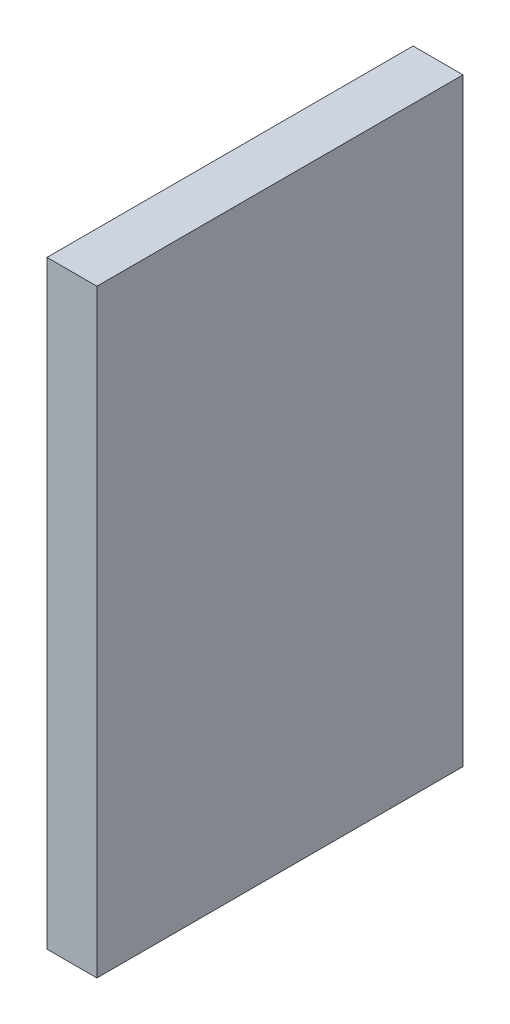
ISO-10303-21;
HEADER;
FILE_DESCRIPTION(('STEP AP214'),'2;1');
FILE_NAME('part.step','',(''),(''),'','','');
FILE_SCHEMA(('AUTOMOTIVE_DESIGN { 1 0 10303 214 1 1 1 1 }'));
ENDSEC;
DATA;
#1=APPLICATION_CONTEXT('core data for automotive mechanical design processes');
#2=APPLICATION_PROTOCOL_DEFINITION('international standard','automotive_design',2000,#1);
#3=PRODUCT_CONTEXT('',#1,'mechanical');
#4=PRODUCT('Part','Part','',(#3));
#5=PRODUCT_RELATED_PRODUCT_CATEGORY('part','',(#4));
#6=PRODUCT_DEFINITION_FORMATION('','',#4);
#7=PRODUCT_DEFINITION_CONTEXT('part definition',#1,'design');
#8=PRODUCT_DEFINITION('design','',#6,#7);
#9=PRODUCT_DEFINITION_SHAPE('','',#8);
#10=(LENGTH_UNIT() NAMED_UNIT(*) SI_UNIT(.MILLI.,.METRE.));
#11=(NAMED_UNIT(*) PLANE_ANGLE_UNIT() SI_UNIT($,.RADIAN.));
#12=(NAMED_UNIT(*) SI_UNIT($,.STERADIAN.) SOLID_ANGLE_UNIT());
#13=UNCERTAINTY_MEASURE_WITH_UNIT(LENGTH_MEASURE(1.E-05),#10,'distance_accuracy_value','');
#14=(GEOMETRIC_REPRESENTATION_CONTEXT(3) GLOBAL_UNCERTAINTY_ASSIGNED_CONTEXT((#13)) GLOBAL_UNIT_ASSIGNED_CONTEXT((#10,
#11,#12)) REPRESENTATION_CONTEXT('',''));
#15=CARTESIAN_POINT('',(0.,0.,0.));
#16=DIRECTION('',(0.,0.,1.));
#17=DIRECTION('',(1.,0.,0.));
#18=AXIS2_PLACEMENT_3D('',#15,#16,#17);
#19=CARTESIAN_POINT('',(37.5,-900.,0.));
#20=DIRECTION('',(1.,0.,0.));
#21=DIRECTION('',(0.,0.,-1.));
#22=AXIS2_PLACEMENT_3D('',#19,#20,#21);
#23=PLANE('',#22);
#24=DIRECTION('',(0.,0.,-1.));
#25=VECTOR('',#24,1.);
#26=CARTESIAN_POINT('',(37.5,0.,0.));
#27=LINE('',#26,#25);
#28=CARTESIAN_POINT('',(37.5,0.,550.));
#29=VERTEX_POINT('',#28);
#30=CARTESIAN_POINT('',(37.5,0.,0.));
#31=VERTEX_POINT('',#30);
#32=EDGE_CURVE('E106',#29,#31,#27,.T.);
#33=ORIENTED_EDGE('',*,*,#32,.F.);
#34=DIRECTION('',(0.,1.,0.));
#35=VECTOR('',#34,1.);
#36=CARTESIAN_POINT('',(37.5,-900.,550.));
#37=LINE('',#36,#35);
#38=CARTESIAN_POINT('',(37.5,-900.,550.));
#39=VERTEX_POINT('',#38);
#40=EDGE_CURVE('E11',#39,#29,#37,.T.);
#41=ORIENTED_EDGE('',*,*,#40,.F.);
#42=DIRECTION('',(0.,0.,-1.));
#43=VECTOR('',#42,1.);
#44=CARTESIAN_POINT('',(37.5,-900.,0.));
#45=LINE('',#44,#43);
#46=CARTESIAN_POINT('',(37.5,-900.,0.));
#47=VERTEX_POINT('',#46);
#48=EDGE_CURVE('E99',#39,#47,#45,.T.);
#49=ORIENTED_EDGE('',*,*,#48,.T.);
#50=DIRECTION('',(0.,1.,0.));
#51=VECTOR('',#50,1.);
#52=CARTESIAN_POINT('',(37.5,-900.,0.));
#53=LINE('',#52,#51);
#54=EDGE_CURVE('E43',#47,#31,#53,.T.);
#55=ORIENTED_EDGE('',*,*,#54,.T.);
#56=EDGE_LOOP('',(#33,#41,#49,#55));
#57=FACE_BOUND('',#56,.T.);
#58=ADVANCED_FACE('F40',(#57),#23,.T.);
#59=CARTESIAN_POINT('',(37.5,-900.,550.));
#60=DIRECTION('',(0.,0.,1.));
#61=DIRECTION('',(1.,0.,0.));
#62=AXIS2_PLACEMENT_3D('',#59,#60,#61);
#63=PLANE('',#62);
#64=DIRECTION('',(1.,0.,0.));
#65=VECTOR('',#64,1.);
#66=CARTESIAN_POINT('',(37.5,0.,550.));
#67=LINE('',#66,#65);
#68=CARTESIAN_POINT('',(-37.5,0.,550.));
#69=VERTEX_POINT('',#68);
#70=EDGE_CURVE('E102',#69,#29,#67,.T.);
#71=ORIENTED_EDGE('',*,*,#70,.F.);
#72=DIRECTION('',(0.,1.,0.));
#73=VECTOR('',#72,1.);
#74=CARTESIAN_POINT('',(-37.5,-900.,550.));
#75=LINE('',#74,#73);
#76=CARTESIAN_POINT('',(-37.5,-900.,550.));
#77=VERTEX_POINT('',#76);
#78=EDGE_CURVE('E49',#77,#69,#75,.T.);
#79=ORIENTED_EDGE('',*,*,#78,.F.);
#80=DIRECTION('',(1.,0.,0.));
#81=VECTOR('',#80,1.);
#82=CARTESIAN_POINT('',(37.5,-900.,550.));
#83=LINE('',#82,#81);
#84=EDGE_CURVE('E96',#77,#39,#83,.T.);
#85=ORIENTED_EDGE('',*,*,#84,.T.);
#86=ORIENTED_EDGE('',*,*,#40,.T.);
#87=EDGE_LOOP('',(#71,#79,#85,#86));
#88=FACE_BOUND('',#87,.T.);
#89=ADVANCED_FACE('F118',(#88),#63,.T.);
#90=CARTESIAN_POINT('',(-37.5,-900.,0.));
#91=DIRECTION('',(-1.,0.,0.));
#92=DIRECTION('',(0.,0.,1.));
#93=AXIS2_PLACEMENT_3D('',#90,#91,#92);
#94=PLANE('',#93);
#95=DIRECTION('',(0.,0.,1.));
#96=VECTOR('',#95,1.);
#97=CARTESIAN_POINT('',(-37.5,0.,0.));
#98=LINE('',#97,#96);
#99=CARTESIAN_POINT('',(-37.5,0.,0.));
#100=VERTEX_POINT('',#99);
#101=EDGE_CURVE('E90',#100,#69,#98,.T.);
#102=ORIENTED_EDGE('',*,*,#101,.F.);
#103=DIRECTION('',(0.,1.,0.));
#104=VECTOR('',#103,1.);
#105=CARTESIAN_POINT('',(-37.5,-900.,0.));
#106=LINE('',#105,#104);
#107=CARTESIAN_POINT('',(-37.5,-900.,0.));
#108=VERTEX_POINT('',#107);
#109=EDGE_CURVE('E85',#108,#100,#106,.T.);
#110=ORIENTED_EDGE('',*,*,#109,.F.);
#111=DIRECTION('',(0.,0.,1.));
#112=VECTOR('',#111,1.);
#113=CARTESIAN_POINT('',(-37.5,-900.,0.));
#114=LINE('',#113,#112);
#115=EDGE_CURVE('E88',#108,#77,#114,.T.);
#116=ORIENTED_EDGE('',*,*,#115,.T.);
#117=ORIENTED_EDGE('',*,*,#78,.T.);
#118=EDGE_LOOP('',(#102,#110,#116,#117));
#119=FACE_BOUND('',#118,.T.);
#120=ADVANCED_FACE('F87',(#119),#94,.T.);
#121=CARTESIAN_POINT('',(37.5,-900.,0.));
#122=DIRECTION('',(0.,0.,-1.));
#123=DIRECTION('',(-1.,0.,0.));
#124=AXIS2_PLACEMENT_3D('',#121,#122,#123);
#125=PLANE('',#124);
#126=DIRECTION('',(-1.,0.,0.));
#127=VECTOR('',#126,1.);
#128=CARTESIAN_POINT('',(37.5,0.,0.));
#129=LINE('',#128,#127);
#130=EDGE_CURVE('E110',#31,#100,#129,.T.);
#131=ORIENTED_EDGE('',*,*,#130,.F.);
#132=ORIENTED_EDGE('',*,*,#54,.F.);
#133=DIRECTION('',(-1.,0.,0.));
#134=VECTOR('',#133,1.);
#135=CARTESIAN_POINT('',(37.5,-900.,0.));
#136=LINE('',#135,#134);
#137=EDGE_CURVE('E95',#47,#108,#136,.T.);
#138=ORIENTED_EDGE('',*,*,#137,.T.);
#139=ORIENTED_EDGE('',*,*,#109,.T.);
#140=EDGE_LOOP('',(#131,#132,#138,#139));
#141=FACE_BOUND('',#140,.T.);
#142=ADVANCED_FACE('F98',(#141),#125,.T.);
#143=CARTESIAN_POINT('',(0.,-900.,0.));
#144=DIRECTION('',(0.,-1.,0.));
#145=DIRECTION('',(0.,0.,-1.));
#146=AXIS2_PLACEMENT_3D('',#143,#144,#145);
#147=PLANE('',#146);
#148=ORIENTED_EDGE('',*,*,#48,.F.);
#149=ORIENTED_EDGE('',*,*,#84,.F.);
#150=ORIENTED_EDGE('',*,*,#115,.F.);
#151=ORIENTED_EDGE('',*,*,#137,.F.);
#152=EDGE_LOOP('',(#148,#149,#150,#151));
#153=FACE_BOUND('',#152,.T.);
#154=ADVANCED_FACE('F94',(#153),#147,.T.);
#155=CARTESIAN_POINT('',(0.,0.,0.));
#156=DIRECTION('',(0.,-1.,0.));
#157=DIRECTION('',(0.,0.,-1.));
#158=AXIS2_PLACEMENT_3D('',#155,#156,#157);
#159=PLANE('',#158);
#160=ORIENTED_EDGE('',*,*,#32,.T.);
#161=ORIENTED_EDGE('',*,*,#130,.T.);
#162=ORIENTED_EDGE('',*,*,#101,.T.);
#163=ORIENTED_EDGE('',*,*,#70,.T.);
#164=EDGE_LOOP('',(#160,#161,#162,#163));
#165=FACE_BOUND('',#164,.T.);
#166=ADVANCED_FACE('F117',(#165),#159,.F.);
#167=CLOSED_SHELL('',(#58,#89,#120,#142,#154,#166));
#168=MANIFOLD_SOLID_BREP('B2',#167);
#169=ADVANCED_BREP_SHAPE_REPRESENTATION('',(#18,#168),#14);
#170=SHAPE_DEFINITION_REPRESENTATION(#9,#169);
ENDSEC;
END-ISO-10303-21;
